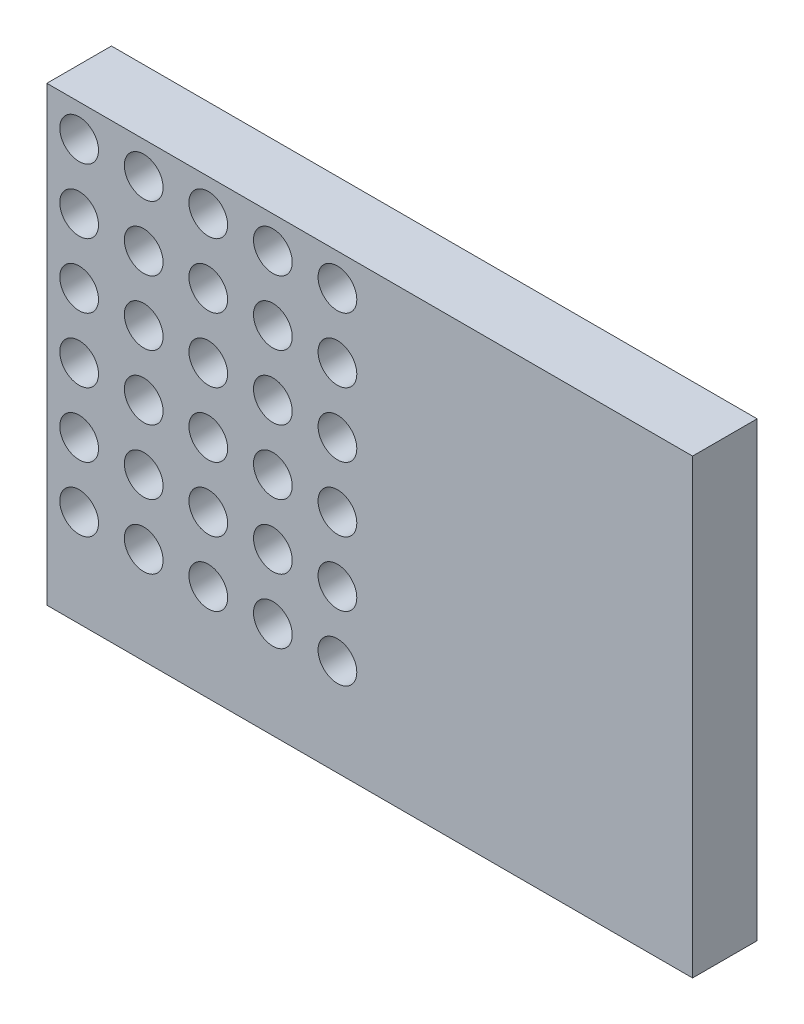
ISO-10303-21;
HEADER;
FILE_DESCRIPTION(('STEP AP214'),'2;1');
FILE_NAME('part.step','',(''),(''),'','','');
FILE_SCHEMA(('AUTOMOTIVE_DESIGN { 1 0 10303 214 1 1 1 1 }'));
ENDSEC;
DATA;
#1=APPLICATION_CONTEXT('core data for automotive mechanical design processes');
#2=APPLICATION_PROTOCOL_DEFINITION('international standard','automotive_design',2000,#1);
#3=PRODUCT_CONTEXT('',#1,'mechanical');
#4=PRODUCT('Part','Part','',(#3));
#5=PRODUCT_RELATED_PRODUCT_CATEGORY('part','',(#4));
#6=PRODUCT_DEFINITION_FORMATION('','',#4);
#7=PRODUCT_DEFINITION_CONTEXT('part definition',#1,'design');
#8=PRODUCT_DEFINITION('design','',#6,#7);
#9=PRODUCT_DEFINITION_SHAPE('','',#8);
#10=(LENGTH_UNIT() NAMED_UNIT(*) SI_UNIT(.MILLI.,.METRE.));
#11=(NAMED_UNIT(*) PLANE_ANGLE_UNIT() SI_UNIT($,.RADIAN.));
#12=(NAMED_UNIT(*) SI_UNIT($,.STERADIAN.) SOLID_ANGLE_UNIT());
#13=UNCERTAINTY_MEASURE_WITH_UNIT(LENGTH_MEASURE(1.E-05),#10,'distance_accuracy_value','');
#14=(GEOMETRIC_REPRESENTATION_CONTEXT(3) GLOBAL_UNCERTAINTY_ASSIGNED_CONTEXT((#13)) GLOBAL_UNIT_ASSIGNED_CONTEXT((#10,
#11,#12)) REPRESENTATION_CONTEXT('',''));
#15=CARTESIAN_POINT('',(0.,0.,0.));
#16=DIRECTION('',(0.,0.,1.));
#17=DIRECTION('',(1.,0.,0.));
#18=AXIS2_PLACEMENT_3D('',#15,#16,#17);
#19=CARTESIAN_POINT('',(-5.00000000000001,-20.,-5.));
#20=DIRECTION('',(0.,0.,1.));
#21=DIRECTION('',(1.,0.,0.));
#22=AXIS2_PLACEMENT_3D('',#19,#20,#21);
#23=CYLINDRICAL_SURFACE('',#22,3.);
#24=CARTESIAN_POINT('',(-5.00000000000001,-20.,-5.));
#25=DIRECTION('',(0.,0.,1.));
#26=DIRECTION('',(1.,0.,0.));
#27=AXIS2_PLACEMENT_3D('',#24,#25,#26);
#28=CIRCLE('',#27,3.);
#29=CARTESIAN_POINT('',(-2.00000000000001,-20.,-5.));
#30=VERTEX_POINT('',#29);
#31=EDGE_CURVE('E45',#30,#30,#28,.T.);
#32=ORIENTED_EDGE('',*,*,#31,.F.);
#33=EDGE_LOOP('',(#32));
#34=FACE_BOUND('',#33,.T.);
#35=CARTESIAN_POINT('',(-5.00000000000001,-20.,5.));
#36=DIRECTION('',(0.,0.,1.));
#37=DIRECTION('',(1.,0.,0.));
#38=AXIS2_PLACEMENT_3D('',#35,#36,#37);
#39=CIRCLE('',#38,3.);
#40=CARTESIAN_POINT('',(-2.00000000000001,-20.,5.));
#41=VERTEX_POINT('',#40);
#42=EDGE_CURVE('E11',#41,#41,#39,.T.);
#43=ORIENTED_EDGE('',*,*,#42,.T.);
#44=EDGE_LOOP('',(#43));
#45=FACE_BOUND('',#44,.T.);
#46=ADVANCED_FACE('F37',(#34,#45),#23,.F.);
#47=CARTESIAN_POINT('',(-15.,-20.,-5.));
#48=DIRECTION('',(0.,0.,1.));
#49=DIRECTION('',(1.,0.,0.));
#50=AXIS2_PLACEMENT_3D('',#47,#48,#49);
#51=CYLINDRICAL_SURFACE('',#50,3.);
#52=CARTESIAN_POINT('',(-15.,-20.,-5.));
#53=DIRECTION('',(0.,0.,1.));
#54=DIRECTION('',(1.,0.,0.));
#55=AXIS2_PLACEMENT_3D('',#52,#53,#54);
#56=CIRCLE('',#55,3.);
#57=CARTESIAN_POINT('',(-12.,-20.,-5.));
#58=VERTEX_POINT('',#57);
#59=EDGE_CURVE('E271',#58,#58,#56,.T.);
#60=ORIENTED_EDGE('',*,*,#59,.F.);
#61=EDGE_LOOP('',(#60));
#62=FACE_BOUND('',#61,.T.);
#63=CARTESIAN_POINT('',(-15.,-20.,5.));
#64=DIRECTION('',(0.,0.,1.));
#65=DIRECTION('',(1.,0.,0.));
#66=AXIS2_PLACEMENT_3D('',#63,#64,#65);
#67=CIRCLE('',#66,3.);
#68=CARTESIAN_POINT('',(-12.,-20.,5.));
#69=VERTEX_POINT('',#68);
#70=EDGE_CURVE('E274',#69,#69,#67,.T.);
#71=ORIENTED_EDGE('',*,*,#70,.T.);
#72=EDGE_LOOP('',(#71));
#73=FACE_BOUND('',#72,.T.);
#74=ADVANCED_FACE('F283',(#62,#73),#51,.F.);
#75=CARTESIAN_POINT('',(-25.,-20.,-5.));
#76=DIRECTION('',(0.,0.,1.));
#77=DIRECTION('',(1.,0.,0.));
#78=AXIS2_PLACEMENT_3D('',#75,#76,#77);
#79=CYLINDRICAL_SURFACE('',#78,3.);
#80=CARTESIAN_POINT('',(-25.,-20.,-5.));
#81=DIRECTION('',(0.,0.,1.));
#82=DIRECTION('',(1.,0.,0.));
#83=AXIS2_PLACEMENT_3D('',#80,#81,#82);
#84=CIRCLE('',#83,3.);
#85=CARTESIAN_POINT('',(-22.,-20.,-5.));
#86=VERTEX_POINT('',#85);
#87=EDGE_CURVE('E265',#86,#86,#84,.T.);
#88=ORIENTED_EDGE('',*,*,#87,.F.);
#89=EDGE_LOOP('',(#88));
#90=FACE_BOUND('',#89,.T.);
#91=CARTESIAN_POINT('',(-25.,-20.,5.));
#92=DIRECTION('',(0.,0.,1.));
#93=DIRECTION('',(1.,0.,0.));
#94=AXIS2_PLACEMENT_3D('',#91,#92,#93);
#95=CIRCLE('',#94,3.);
#96=CARTESIAN_POINT('',(-22.,-20.,5.));
#97=VERTEX_POINT('',#96);
#98=EDGE_CURVE('E268',#97,#97,#95,.T.);
#99=ORIENTED_EDGE('',*,*,#98,.T.);
#100=EDGE_LOOP('',(#99));
#101=FACE_BOUND('',#100,.T.);
#102=ADVANCED_FACE('F410',(#90,#101),#79,.F.);
#103=CARTESIAN_POINT('',(-35.,-20.,-5.));
#104=DIRECTION('',(0.,0.,1.));
#105=DIRECTION('',(1.,0.,0.));
#106=AXIS2_PLACEMENT_3D('',#103,#104,#105);
#107=CYLINDRICAL_SURFACE('',#106,3.);
#108=CARTESIAN_POINT('',(-35.,-20.,-5.));
#109=DIRECTION('',(0.,0.,1.));
#110=DIRECTION('',(1.,0.,0.));
#111=AXIS2_PLACEMENT_3D('',#108,#109,#110);
#112=CIRCLE('',#111,3.);
#113=CARTESIAN_POINT('',(-32.,-20.,-5.));
#114=VERTEX_POINT('',#113);
#115=EDGE_CURVE('E259',#114,#114,#112,.T.);
#116=ORIENTED_EDGE('',*,*,#115,.F.);
#117=EDGE_LOOP('',(#116));
#118=FACE_BOUND('',#117,.T.);
#119=CARTESIAN_POINT('',(-35.,-20.,5.));
#120=DIRECTION('',(0.,0.,1.));
#121=DIRECTION('',(1.,0.,0.));
#122=AXIS2_PLACEMENT_3D('',#119,#120,#121);
#123=CIRCLE('',#122,3.);
#124=CARTESIAN_POINT('',(-32.,-20.,5.));
#125=VERTEX_POINT('',#124);
#126=EDGE_CURVE('E262',#125,#125,#123,.T.);
#127=ORIENTED_EDGE('',*,*,#126,.T.);
#128=EDGE_LOOP('',(#127));
#129=FACE_BOUND('',#128,.T.);
#130=ADVANCED_FACE('F406',(#118,#129),#107,.F.);
#131=CARTESIAN_POINT('',(-45.,-20.,-5.));
#132=DIRECTION('',(0.,0.,1.));
#133=DIRECTION('',(1.,0.,0.));
#134=AXIS2_PLACEMENT_3D('',#131,#132,#133);
#135=CYLINDRICAL_SURFACE('',#134,3.);
#136=CARTESIAN_POINT('',(-45.,-20.,-5.));
#137=DIRECTION('',(0.,0.,1.));
#138=DIRECTION('',(1.,0.,0.));
#139=AXIS2_PLACEMENT_3D('',#136,#137,#138);
#140=CIRCLE('',#139,3.);
#141=CARTESIAN_POINT('',(-42.,-20.,-5.));
#142=VERTEX_POINT('',#141);
#143=EDGE_CURVE('E253',#142,#142,#140,.T.);
#144=ORIENTED_EDGE('',*,*,#143,.F.);
#145=EDGE_LOOP('',(#144));
#146=FACE_BOUND('',#145,.T.);
#147=CARTESIAN_POINT('',(-45.,-20.,5.));
#148=DIRECTION('',(0.,0.,1.));
#149=DIRECTION('',(1.,0.,0.));
#150=AXIS2_PLACEMENT_3D('',#147,#148,#149);
#151=CIRCLE('',#150,3.);
#152=CARTESIAN_POINT('',(-42.,-20.,5.));
#153=VERTEX_POINT('',#152);
#154=EDGE_CURVE('E256',#153,#153,#151,.T.);
#155=ORIENTED_EDGE('',*,*,#154,.T.);
#156=EDGE_LOOP('',(#155));
#157=FACE_BOUND('',#156,.T.);
#158=ADVANCED_FACE('F402',(#146,#157),#135,.F.);
#159=CARTESIAN_POINT('',(-5.00000000000001,-10.,-5.));
#160=DIRECTION('',(0.,0.,1.));
#161=DIRECTION('',(1.,0.,0.));
#162=AXIS2_PLACEMENT_3D('',#159,#160,#161);
#163=CYLINDRICAL_SURFACE('',#162,3.);
#164=CARTESIAN_POINT('',(-5.00000000000001,-10.,-5.));
#165=DIRECTION('',(0.,0.,1.));
#166=DIRECTION('',(1.,0.,0.));
#167=AXIS2_PLACEMENT_3D('',#164,#165,#166);
#168=CIRCLE('',#167,3.);
#169=CARTESIAN_POINT('',(-2.00000000000001,-10.,-5.));
#170=VERTEX_POINT('',#169);
#171=EDGE_CURVE('E247',#170,#170,#168,.T.);
#172=ORIENTED_EDGE('',*,*,#171,.F.);
#173=EDGE_LOOP('',(#172));
#174=FACE_BOUND('',#173,.T.);
#175=CARTESIAN_POINT('',(-5.00000000000001,-10.,5.));
#176=DIRECTION('',(0.,0.,1.));
#177=DIRECTION('',(1.,0.,0.));
#178=AXIS2_PLACEMENT_3D('',#175,#176,#177);
#179=CIRCLE('',#178,3.);
#180=CARTESIAN_POINT('',(-2.00000000000001,-10.,5.));
#181=VERTEX_POINT('',#180);
#182=EDGE_CURVE('E250',#181,#181,#179,.T.);
#183=ORIENTED_EDGE('',*,*,#182,.T.);
#184=EDGE_LOOP('',(#183));
#185=FACE_BOUND('',#184,.T.);
#186=ADVANCED_FACE('F398',(#174,#185),#163,.F.);
#187=CARTESIAN_POINT('',(-15.,-10.,-5.));
#188=DIRECTION('',(0.,0.,1.));
#189=DIRECTION('',(1.,0.,0.));
#190=AXIS2_PLACEMENT_3D('',#187,#188,#189);
#191=CYLINDRICAL_SURFACE('',#190,3.);
#192=CARTESIAN_POINT('',(-15.,-10.,-5.));
#193=DIRECTION('',(0.,0.,1.));
#194=DIRECTION('',(1.,0.,0.));
#195=AXIS2_PLACEMENT_3D('',#192,#193,#194);
#196=CIRCLE('',#195,3.);
#197=CARTESIAN_POINT('',(-12.,-10.,-5.));
#198=VERTEX_POINT('',#197);
#199=EDGE_CURVE('E241',#198,#198,#196,.T.);
#200=ORIENTED_EDGE('',*,*,#199,.F.);
#201=EDGE_LOOP('',(#200));
#202=FACE_BOUND('',#201,.T.);
#203=CARTESIAN_POINT('',(-15.,-10.,5.));
#204=DIRECTION('',(0.,0.,1.));
#205=DIRECTION('',(1.,0.,0.));
#206=AXIS2_PLACEMENT_3D('',#203,#204,#205);
#207=CIRCLE('',#206,3.);
#208=CARTESIAN_POINT('',(-12.,-10.,5.));
#209=VERTEX_POINT('',#208);
#210=EDGE_CURVE('E244',#209,#209,#207,.T.);
#211=ORIENTED_EDGE('',*,*,#210,.T.);
#212=EDGE_LOOP('',(#211));
#213=FACE_BOUND('',#212,.T.);
#214=ADVANCED_FACE('F394',(#202,#213),#191,.F.);
#215=CARTESIAN_POINT('',(-25.,-10.,-5.));
#216=DIRECTION('',(0.,0.,1.));
#217=DIRECTION('',(1.,0.,0.));
#218=AXIS2_PLACEMENT_3D('',#215,#216,#217);
#219=CYLINDRICAL_SURFACE('',#218,3.);
#220=CARTESIAN_POINT('',(-25.,-10.,-5.));
#221=DIRECTION('',(0.,0.,1.));
#222=DIRECTION('',(1.,0.,0.));
#223=AXIS2_PLACEMENT_3D('',#220,#221,#222);
#224=CIRCLE('',#223,3.);
#225=CARTESIAN_POINT('',(-22.,-10.,-5.));
#226=VERTEX_POINT('',#225);
#227=EDGE_CURVE('E235',#226,#226,#224,.T.);
#228=ORIENTED_EDGE('',*,*,#227,.F.);
#229=EDGE_LOOP('',(#228));
#230=FACE_BOUND('',#229,.T.);
#231=CARTESIAN_POINT('',(-25.,-10.,5.));
#232=DIRECTION('',(0.,0.,1.));
#233=DIRECTION('',(1.,0.,0.));
#234=AXIS2_PLACEMENT_3D('',#231,#232,#233);
#235=CIRCLE('',#234,3.);
#236=CARTESIAN_POINT('',(-22.,-10.,5.));
#237=VERTEX_POINT('',#236);
#238=EDGE_CURVE('E238',#237,#237,#235,.T.);
#239=ORIENTED_EDGE('',*,*,#238,.T.);
#240=EDGE_LOOP('',(#239));
#241=FACE_BOUND('',#240,.T.);
#242=ADVANCED_FACE('F390',(#230,#241),#219,.F.);
#243=CARTESIAN_POINT('',(-35.,-10.,-5.));
#244=DIRECTION('',(0.,0.,1.));
#245=DIRECTION('',(1.,0.,0.));
#246=AXIS2_PLACEMENT_3D('',#243,#244,#245);
#247=CYLINDRICAL_SURFACE('',#246,3.);
#248=CARTESIAN_POINT('',(-35.,-10.,-5.));
#249=DIRECTION('',(0.,0.,1.));
#250=DIRECTION('',(1.,0.,0.));
#251=AXIS2_PLACEMENT_3D('',#248,#249,#250);
#252=CIRCLE('',#251,3.);
#253=CARTESIAN_POINT('',(-32.,-10.,-5.));
#254=VERTEX_POINT('',#253);
#255=EDGE_CURVE('E229',#254,#254,#252,.T.);
#256=ORIENTED_EDGE('',*,*,#255,.F.);
#257=EDGE_LOOP('',(#256));
#258=FACE_BOUND('',#257,.T.);
#259=CARTESIAN_POINT('',(-35.,-10.,5.));
#260=DIRECTION('',(0.,0.,1.));
#261=DIRECTION('',(1.,0.,0.));
#262=AXIS2_PLACEMENT_3D('',#259,#260,#261);
#263=CIRCLE('',#262,3.);
#264=CARTESIAN_POINT('',(-32.,-10.,5.));
#265=VERTEX_POINT('',#264);
#266=EDGE_CURVE('E232',#265,#265,#263,.T.);
#267=ORIENTED_EDGE('',*,*,#266,.T.);
#268=EDGE_LOOP('',(#267));
#269=FACE_BOUND('',#268,.T.);
#270=ADVANCED_FACE('F386',(#258,#269),#247,.F.);
#271=CARTESIAN_POINT('',(-45.,-10.,-5.));
#272=DIRECTION('',(0.,0.,1.));
#273=DIRECTION('',(1.,0.,0.));
#274=AXIS2_PLACEMENT_3D('',#271,#272,#273);
#275=CYLINDRICAL_SURFACE('',#274,3.);
#276=CARTESIAN_POINT('',(-45.,-10.,-5.));
#277=DIRECTION('',(0.,0.,1.));
#278=DIRECTION('',(1.,0.,0.));
#279=AXIS2_PLACEMENT_3D('',#276,#277,#278);
#280=CIRCLE('',#279,3.);
#281=CARTESIAN_POINT('',(-42.,-10.,-5.));
#282=VERTEX_POINT('',#281);
#283=EDGE_CURVE('E223',#282,#282,#280,.T.);
#284=ORIENTED_EDGE('',*,*,#283,.F.);
#285=EDGE_LOOP('',(#284));
#286=FACE_BOUND('',#285,.T.);
#287=CARTESIAN_POINT('',(-45.,-10.,5.));
#288=DIRECTION('',(0.,0.,1.));
#289=DIRECTION('',(1.,0.,0.));
#290=AXIS2_PLACEMENT_3D('',#287,#288,#289);
#291=CIRCLE('',#290,3.);
#292=CARTESIAN_POINT('',(-42.,-10.,5.));
#293=VERTEX_POINT('',#292);
#294=EDGE_CURVE('E226',#293,#293,#291,.T.);
#295=ORIENTED_EDGE('',*,*,#294,.T.);
#296=EDGE_LOOP('',(#295));
#297=FACE_BOUND('',#296,.T.);
#298=ADVANCED_FACE('F382',(#286,#297),#275,.F.);
#299=CARTESIAN_POINT('',(-5.00000000000001,0.,-5.));
#300=DIRECTION('',(0.,0.,1.));
#301=DIRECTION('',(1.,0.,0.));
#302=AXIS2_PLACEMENT_3D('',#299,#300,#301);
#303=CYLINDRICAL_SURFACE('',#302,3.);
#304=CARTESIAN_POINT('',(-5.00000000000001,0.,-5.));
#305=DIRECTION('',(0.,0.,1.));
#306=DIRECTION('',(1.,0.,0.));
#307=AXIS2_PLACEMENT_3D('',#304,#305,#306);
#308=CIRCLE('',#307,3.);
#309=CARTESIAN_POINT('',(-2.00000000000001,0.,-5.));
#310=VERTEX_POINT('',#309);
#311=EDGE_CURVE('E217',#310,#310,#308,.T.);
#312=ORIENTED_EDGE('',*,*,#311,.F.);
#313=EDGE_LOOP('',(#312));
#314=FACE_BOUND('',#313,.T.);
#315=CARTESIAN_POINT('',(-5.00000000000001,0.,5.));
#316=DIRECTION('',(0.,0.,1.));
#317=DIRECTION('',(1.,0.,0.));
#318=AXIS2_PLACEMENT_3D('',#315,#316,#317);
#319=CIRCLE('',#318,3.);
#320=CARTESIAN_POINT('',(-2.00000000000001,0.,5.));
#321=VERTEX_POINT('',#320);
#322=EDGE_CURVE('E220',#321,#321,#319,.T.);
#323=ORIENTED_EDGE('',*,*,#322,.T.);
#324=EDGE_LOOP('',(#323));
#325=FACE_BOUND('',#324,.T.);
#326=ADVANCED_FACE('F378',(#314,#325),#303,.F.);
#327=CARTESIAN_POINT('',(-15.,0.,-5.));
#328=DIRECTION('',(0.,0.,1.));
#329=DIRECTION('',(1.,0.,0.));
#330=AXIS2_PLACEMENT_3D('',#327,#328,#329);
#331=CYLINDRICAL_SURFACE('',#330,3.);
#332=CARTESIAN_POINT('',(-15.,0.,-5.));
#333=DIRECTION('',(0.,0.,1.));
#334=DIRECTION('',(1.,0.,0.));
#335=AXIS2_PLACEMENT_3D('',#332,#333,#334);
#336=CIRCLE('',#335,3.);
#337=CARTESIAN_POINT('',(-12.,0.,-5.));
#338=VERTEX_POINT('',#337);
#339=EDGE_CURVE('E211',#338,#338,#336,.T.);
#340=ORIENTED_EDGE('',*,*,#339,.F.);
#341=EDGE_LOOP('',(#340));
#342=FACE_BOUND('',#341,.T.);
#343=CARTESIAN_POINT('',(-15.,0.,5.));
#344=DIRECTION('',(0.,0.,1.));
#345=DIRECTION('',(1.,0.,0.));
#346=AXIS2_PLACEMENT_3D('',#343,#344,#345);
#347=CIRCLE('',#346,3.);
#348=CARTESIAN_POINT('',(-12.,0.,5.));
#349=VERTEX_POINT('',#348);
#350=EDGE_CURVE('E214',#349,#349,#347,.T.);
#351=ORIENTED_EDGE('',*,*,#350,.T.);
#352=EDGE_LOOP('',(#351));
#353=FACE_BOUND('',#352,.T.);
#354=ADVANCED_FACE('F374',(#342,#353),#331,.F.);
#355=CARTESIAN_POINT('',(-25.,0.,-5.));
#356=DIRECTION('',(0.,0.,1.));
#357=DIRECTION('',(1.,0.,0.));
#358=AXIS2_PLACEMENT_3D('',#355,#356,#357);
#359=CYLINDRICAL_SURFACE('',#358,3.);
#360=CARTESIAN_POINT('',(-25.,0.,-5.));
#361=DIRECTION('',(0.,0.,1.));
#362=DIRECTION('',(1.,0.,0.));
#363=AXIS2_PLACEMENT_3D('',#360,#361,#362);
#364=CIRCLE('',#363,3.);
#365=CARTESIAN_POINT('',(-22.,0.,-5.));
#366=VERTEX_POINT('',#365);
#367=EDGE_CURVE('E205',#366,#366,#364,.T.);
#368=ORIENTED_EDGE('',*,*,#367,.F.);
#369=EDGE_LOOP('',(#368));
#370=FACE_BOUND('',#369,.T.);
#371=CARTESIAN_POINT('',(-25.,0.,5.));
#372=DIRECTION('',(0.,0.,1.));
#373=DIRECTION('',(1.,0.,0.));
#374=AXIS2_PLACEMENT_3D('',#371,#372,#373);
#375=CIRCLE('',#374,3.);
#376=CARTESIAN_POINT('',(-22.,0.,5.));
#377=VERTEX_POINT('',#376);
#378=EDGE_CURVE('E208',#377,#377,#375,.T.);
#379=ORIENTED_EDGE('',*,*,#378,.T.);
#380=EDGE_LOOP('',(#379));
#381=FACE_BOUND('',#380,.T.);
#382=ADVANCED_FACE('F370',(#370,#381),#359,.F.);
#383=CARTESIAN_POINT('',(-35.,0.,-5.));
#384=DIRECTION('',(0.,0.,1.));
#385=DIRECTION('',(1.,0.,0.));
#386=AXIS2_PLACEMENT_3D('',#383,#384,#385);
#387=CYLINDRICAL_SURFACE('',#386,3.);
#388=CARTESIAN_POINT('',(-35.,0.,-5.));
#389=DIRECTION('',(0.,0.,1.));
#390=DIRECTION('',(1.,0.,0.));
#391=AXIS2_PLACEMENT_3D('',#388,#389,#390);
#392=CIRCLE('',#391,3.);
#393=CARTESIAN_POINT('',(-32.,0.,-5.));
#394=VERTEX_POINT('',#393);
#395=EDGE_CURVE('E199',#394,#394,#392,.T.);
#396=ORIENTED_EDGE('',*,*,#395,.F.);
#397=EDGE_LOOP('',(#396));
#398=FACE_BOUND('',#397,.T.);
#399=CARTESIAN_POINT('',(-35.,0.,5.));
#400=DIRECTION('',(0.,0.,1.));
#401=DIRECTION('',(1.,0.,0.));
#402=AXIS2_PLACEMENT_3D('',#399,#400,#401);
#403=CIRCLE('',#402,3.);
#404=CARTESIAN_POINT('',(-32.,0.,5.));
#405=VERTEX_POINT('',#404);
#406=EDGE_CURVE('E202',#405,#405,#403,.T.);
#407=ORIENTED_EDGE('',*,*,#406,.T.);
#408=EDGE_LOOP('',(#407));
#409=FACE_BOUND('',#408,.T.);
#410=ADVANCED_FACE('F366',(#398,#409),#387,.F.);
#411=CARTESIAN_POINT('',(-45.,0.,-5.));
#412=DIRECTION('',(0.,0.,1.));
#413=DIRECTION('',(1.,0.,0.));
#414=AXIS2_PLACEMENT_3D('',#411,#412,#413);
#415=CYLINDRICAL_SURFACE('',#414,3.);
#416=CARTESIAN_POINT('',(-45.,0.,-5.));
#417=DIRECTION('',(0.,0.,1.));
#418=DIRECTION('',(1.,0.,0.));
#419=AXIS2_PLACEMENT_3D('',#416,#417,#418);
#420=CIRCLE('',#419,3.);
#421=CARTESIAN_POINT('',(-42.,0.,-5.));
#422=VERTEX_POINT('',#421);
#423=EDGE_CURVE('E193',#422,#422,#420,.T.);
#424=ORIENTED_EDGE('',*,*,#423,.F.);
#425=EDGE_LOOP('',(#424));
#426=FACE_BOUND('',#425,.T.);
#427=CARTESIAN_POINT('',(-45.,0.,5.));
#428=DIRECTION('',(0.,0.,1.));
#429=DIRECTION('',(1.,0.,0.));
#430=AXIS2_PLACEMENT_3D('',#427,#428,#429);
#431=CIRCLE('',#430,3.);
#432=CARTESIAN_POINT('',(-42.,0.,5.));
#433=VERTEX_POINT('',#432);
#434=EDGE_CURVE('E196',#433,#433,#431,.T.);
#435=ORIENTED_EDGE('',*,*,#434,.T.);
#436=EDGE_LOOP('',(#435));
#437=FACE_BOUND('',#436,.T.);
#438=ADVANCED_FACE('F362',(#426,#437),#415,.F.);
#439=CARTESIAN_POINT('',(-5.00000000000001,10.,-5.));
#440=DIRECTION('',(0.,0.,1.));
#441=DIRECTION('',(1.,0.,0.));
#442=AXIS2_PLACEMENT_3D('',#439,#440,#441);
#443=CYLINDRICAL_SURFACE('',#442,3.);
#444=CARTESIAN_POINT('',(-5.00000000000001,10.,-5.));
#445=DIRECTION('',(0.,0.,1.));
#446=DIRECTION('',(1.,0.,0.));
#447=AXIS2_PLACEMENT_3D('',#444,#445,#446);
#448=CIRCLE('',#447,3.);
#449=CARTESIAN_POINT('',(-2.00000000000001,10.,-5.));
#450=VERTEX_POINT('',#449);
#451=EDGE_CURVE('E187',#450,#450,#448,.T.);
#452=ORIENTED_EDGE('',*,*,#451,.F.);
#453=EDGE_LOOP('',(#452));
#454=FACE_BOUND('',#453,.T.);
#455=CARTESIAN_POINT('',(-5.00000000000001,10.,5.));
#456=DIRECTION('',(0.,0.,1.));
#457=DIRECTION('',(1.,0.,0.));
#458=AXIS2_PLACEMENT_3D('',#455,#456,#457);
#459=CIRCLE('',#458,3.);
#460=CARTESIAN_POINT('',(-2.00000000000001,10.,5.));
#461=VERTEX_POINT('',#460);
#462=EDGE_CURVE('E190',#461,#461,#459,.T.);
#463=ORIENTED_EDGE('',*,*,#462,.T.);
#464=EDGE_LOOP('',(#463));
#465=FACE_BOUND('',#464,.T.);
#466=ADVANCED_FACE('F358',(#454,#465),#443,.F.);
#467=CARTESIAN_POINT('',(-15.,10.,-5.));
#468=DIRECTION('',(0.,0.,1.));
#469=DIRECTION('',(1.,0.,0.));
#470=AXIS2_PLACEMENT_3D('',#467,#468,#469);
#471=CYLINDRICAL_SURFACE('',#470,3.);
#472=CARTESIAN_POINT('',(-15.,10.,-5.));
#473=DIRECTION('',(0.,0.,1.));
#474=DIRECTION('',(1.,0.,0.));
#475=AXIS2_PLACEMENT_3D('',#472,#473,#474);
#476=CIRCLE('',#475,3.);
#477=CARTESIAN_POINT('',(-12.,10.,-5.));
#478=VERTEX_POINT('',#477);
#479=EDGE_CURVE('E181',#478,#478,#476,.T.);
#480=ORIENTED_EDGE('',*,*,#479,.F.);
#481=EDGE_LOOP('',(#480));
#482=FACE_BOUND('',#481,.T.);
#483=CARTESIAN_POINT('',(-15.,10.,5.));
#484=DIRECTION('',(0.,0.,1.));
#485=DIRECTION('',(1.,0.,0.));
#486=AXIS2_PLACEMENT_3D('',#483,#484,#485);
#487=CIRCLE('',#486,3.);
#488=CARTESIAN_POINT('',(-12.,10.,5.));
#489=VERTEX_POINT('',#488);
#490=EDGE_CURVE('E184',#489,#489,#487,.T.);
#491=ORIENTED_EDGE('',*,*,#490,.T.);
#492=EDGE_LOOP('',(#491));
#493=FACE_BOUND('',#492,.T.);
#494=ADVANCED_FACE('F354',(#482,#493),#471,.F.);
#495=CARTESIAN_POINT('',(-25.,10.,-5.));
#496=DIRECTION('',(0.,0.,1.));
#497=DIRECTION('',(1.,0.,0.));
#498=AXIS2_PLACEMENT_3D('',#495,#496,#497);
#499=CYLINDRICAL_SURFACE('',#498,3.);
#500=CARTESIAN_POINT('',(-25.,10.,-5.));
#501=DIRECTION('',(0.,0.,1.));
#502=DIRECTION('',(1.,0.,0.));
#503=AXIS2_PLACEMENT_3D('',#500,#501,#502);
#504=CIRCLE('',#503,3.);
#505=CARTESIAN_POINT('',(-22.,10.,-5.));
#506=VERTEX_POINT('',#505);
#507=EDGE_CURVE('E175',#506,#506,#504,.T.);
#508=ORIENTED_EDGE('',*,*,#507,.F.);
#509=EDGE_LOOP('',(#508));
#510=FACE_BOUND('',#509,.T.);
#511=CARTESIAN_POINT('',(-25.,10.,5.));
#512=DIRECTION('',(0.,0.,1.));
#513=DIRECTION('',(1.,0.,0.));
#514=AXIS2_PLACEMENT_3D('',#511,#512,#513);
#515=CIRCLE('',#514,3.);
#516=CARTESIAN_POINT('',(-22.,10.,5.));
#517=VERTEX_POINT('',#516);
#518=EDGE_CURVE('E178',#517,#517,#515,.T.);
#519=ORIENTED_EDGE('',*,*,#518,.T.);
#520=EDGE_LOOP('',(#519));
#521=FACE_BOUND('',#520,.T.);
#522=ADVANCED_FACE('F350',(#510,#521),#499,.F.);
#523=CARTESIAN_POINT('',(-35.,10.,-5.));
#524=DIRECTION('',(0.,0.,1.));
#525=DIRECTION('',(1.,0.,0.));
#526=AXIS2_PLACEMENT_3D('',#523,#524,#525);
#527=CYLINDRICAL_SURFACE('',#526,3.);
#528=CARTESIAN_POINT('',(-35.,10.,-5.));
#529=DIRECTION('',(0.,0.,1.));
#530=DIRECTION('',(1.,0.,0.));
#531=AXIS2_PLACEMENT_3D('',#528,#529,#530);
#532=CIRCLE('',#531,3.);
#533=CARTESIAN_POINT('',(-32.,10.,-5.));
#534=VERTEX_POINT('',#533);
#535=EDGE_CURVE('E169',#534,#534,#532,.T.);
#536=ORIENTED_EDGE('',*,*,#535,.F.);
#537=EDGE_LOOP('',(#536));
#538=FACE_BOUND('',#537,.T.);
#539=CARTESIAN_POINT('',(-35.,10.,5.));
#540=DIRECTION('',(0.,0.,1.));
#541=DIRECTION('',(1.,0.,0.));
#542=AXIS2_PLACEMENT_3D('',#539,#540,#541);
#543=CIRCLE('',#542,3.);
#544=CARTESIAN_POINT('',(-32.,10.,5.));
#545=VERTEX_POINT('',#544);
#546=EDGE_CURVE('E172',#545,#545,#543,.T.);
#547=ORIENTED_EDGE('',*,*,#546,.T.);
#548=EDGE_LOOP('',(#547));
#549=FACE_BOUND('',#548,.T.);
#550=ADVANCED_FACE('F346',(#538,#549),#527,.F.);
#551=CARTESIAN_POINT('',(-45.,10.,-5.));
#552=DIRECTION('',(0.,0.,1.));
#553=DIRECTION('',(1.,0.,0.));
#554=AXIS2_PLACEMENT_3D('',#551,#552,#553);
#555=CYLINDRICAL_SURFACE('',#554,3.);
#556=CARTESIAN_POINT('',(-45.,10.,-5.));
#557=DIRECTION('',(0.,0.,1.));
#558=DIRECTION('',(1.,0.,0.));
#559=AXIS2_PLACEMENT_3D('',#556,#557,#558);
#560=CIRCLE('',#559,3.);
#561=CARTESIAN_POINT('',(-42.,10.,-5.));
#562=VERTEX_POINT('',#561);
#563=EDGE_CURVE('E163',#562,#562,#560,.T.);
#564=ORIENTED_EDGE('',*,*,#563,.F.);
#565=EDGE_LOOP('',(#564));
#566=FACE_BOUND('',#565,.T.);
#567=CARTESIAN_POINT('',(-45.,10.,5.));
#568=DIRECTION('',(0.,0.,1.));
#569=DIRECTION('',(1.,0.,0.));
#570=AXIS2_PLACEMENT_3D('',#567,#568,#569);
#571=CIRCLE('',#570,3.);
#572=CARTESIAN_POINT('',(-42.,10.,5.));
#573=VERTEX_POINT('',#572);
#574=EDGE_CURVE('E166',#573,#573,#571,.T.);
#575=ORIENTED_EDGE('',*,*,#574,.T.);
#576=EDGE_LOOP('',(#575));
#577=FACE_BOUND('',#576,.T.);
#578=ADVANCED_FACE('F342',(#566,#577),#555,.F.);
#579=CARTESIAN_POINT('',(-5.00000000000002,20.,-5.));
#580=DIRECTION('',(0.,0.,1.));
#581=DIRECTION('',(1.,0.,0.));
#582=AXIS2_PLACEMENT_3D('',#579,#580,#581);
#583=CYLINDRICAL_SURFACE('',#582,3.);
#584=CARTESIAN_POINT('',(-5.00000000000002,20.,-5.));
#585=DIRECTION('',(0.,0.,1.));
#586=DIRECTION('',(1.,0.,0.));
#587=AXIS2_PLACEMENT_3D('',#584,#585,#586);
#588=CIRCLE('',#587,3.);
#589=CARTESIAN_POINT('',(-2.00000000000002,20.,-5.));
#590=VERTEX_POINT('',#589);
#591=EDGE_CURVE('E157',#590,#590,#588,.T.);
#592=ORIENTED_EDGE('',*,*,#591,.F.);
#593=EDGE_LOOP('',(#592));
#594=FACE_BOUND('',#593,.T.);
#595=CARTESIAN_POINT('',(-5.00000000000002,20.,5.));
#596=DIRECTION('',(0.,0.,1.));
#597=DIRECTION('',(1.,0.,0.));
#598=AXIS2_PLACEMENT_3D('',#595,#596,#597);
#599=CIRCLE('',#598,3.);
#600=CARTESIAN_POINT('',(-2.00000000000002,20.,5.));
#601=VERTEX_POINT('',#600);
#602=EDGE_CURVE('E160',#601,#601,#599,.T.);
#603=ORIENTED_EDGE('',*,*,#602,.T.);
#604=EDGE_LOOP('',(#603));
#605=FACE_BOUND('',#604,.T.);
#606=ADVANCED_FACE('F338',(#594,#605),#583,.F.);
#607=CARTESIAN_POINT('',(-15.,20.,-5.));
#608=DIRECTION('',(0.,0.,1.));
#609=DIRECTION('',(1.,0.,0.));
#610=AXIS2_PLACEMENT_3D('',#607,#608,#609);
#611=CYLINDRICAL_SURFACE('',#610,3.);
#612=CARTESIAN_POINT('',(-15.,20.,-5.));
#613=DIRECTION('',(0.,0.,1.));
#614=DIRECTION('',(1.,0.,0.));
#615=AXIS2_PLACEMENT_3D('',#612,#613,#614);
#616=CIRCLE('',#615,3.);
#617=CARTESIAN_POINT('',(-12.,20.,-5.));
#618=VERTEX_POINT('',#617);
#619=EDGE_CURVE('E151',#618,#618,#616,.T.);
#620=ORIENTED_EDGE('',*,*,#619,.F.);
#621=EDGE_LOOP('',(#620));
#622=FACE_BOUND('',#621,.T.);
#623=CARTESIAN_POINT('',(-15.,20.,5.));
#624=DIRECTION('',(0.,0.,1.));
#625=DIRECTION('',(1.,0.,0.));
#626=AXIS2_PLACEMENT_3D('',#623,#624,#625);
#627=CIRCLE('',#626,3.);
#628=CARTESIAN_POINT('',(-12.,20.,5.));
#629=VERTEX_POINT('',#628);
#630=EDGE_CURVE('E154',#629,#629,#627,.T.);
#631=ORIENTED_EDGE('',*,*,#630,.T.);
#632=EDGE_LOOP('',(#631));
#633=FACE_BOUND('',#632,.T.);
#634=ADVANCED_FACE('F334',(#622,#633),#611,.F.);
#635=CARTESIAN_POINT('',(-25.,20.,-5.));
#636=DIRECTION('',(0.,0.,1.));
#637=DIRECTION('',(1.,0.,0.));
#638=AXIS2_PLACEMENT_3D('',#635,#636,#637);
#639=CYLINDRICAL_SURFACE('',#638,3.);
#640=CARTESIAN_POINT('',(-25.,20.,-5.));
#641=DIRECTION('',(0.,0.,1.));
#642=DIRECTION('',(1.,0.,0.));
#643=AXIS2_PLACEMENT_3D('',#640,#641,#642);
#644=CIRCLE('',#643,3.);
#645=CARTESIAN_POINT('',(-22.,20.,-5.));
#646=VERTEX_POINT('',#645);
#647=EDGE_CURVE('E145',#646,#646,#644,.T.);
#648=ORIENTED_EDGE('',*,*,#647,.F.);
#649=EDGE_LOOP('',(#648));
#650=FACE_BOUND('',#649,.T.);
#651=CARTESIAN_POINT('',(-25.,20.,5.));
#652=DIRECTION('',(0.,0.,1.));
#653=DIRECTION('',(1.,0.,0.));
#654=AXIS2_PLACEMENT_3D('',#651,#652,#653);
#655=CIRCLE('',#654,3.);
#656=CARTESIAN_POINT('',(-22.,20.,5.));
#657=VERTEX_POINT('',#656);
#658=EDGE_CURVE('E148',#657,#657,#655,.T.);
#659=ORIENTED_EDGE('',*,*,#658,.T.);
#660=EDGE_LOOP('',(#659));
#661=FACE_BOUND('',#660,.T.);
#662=ADVANCED_FACE('F330',(#650,#661),#639,.F.);
#663=CARTESIAN_POINT('',(-35.,20.,-5.));
#664=DIRECTION('',(0.,0.,1.));
#665=DIRECTION('',(1.,0.,0.));
#666=AXIS2_PLACEMENT_3D('',#663,#664,#665);
#667=CYLINDRICAL_SURFACE('',#666,3.);
#668=CARTESIAN_POINT('',(-35.,20.,-5.));
#669=DIRECTION('',(0.,0.,1.));
#670=DIRECTION('',(1.,0.,0.));
#671=AXIS2_PLACEMENT_3D('',#668,#669,#670);
#672=CIRCLE('',#671,3.);
#673=CARTESIAN_POINT('',(-32.,20.,-5.));
#674=VERTEX_POINT('',#673);
#675=EDGE_CURVE('E139',#674,#674,#672,.T.);
#676=ORIENTED_EDGE('',*,*,#675,.F.);
#677=EDGE_LOOP('',(#676));
#678=FACE_BOUND('',#677,.T.);
#679=CARTESIAN_POINT('',(-35.,20.,5.));
#680=DIRECTION('',(0.,0.,1.));
#681=DIRECTION('',(1.,0.,0.));
#682=AXIS2_PLACEMENT_3D('',#679,#680,#681);
#683=CIRCLE('',#682,3.);
#684=CARTESIAN_POINT('',(-32.,20.,5.));
#685=VERTEX_POINT('',#684);
#686=EDGE_CURVE('E142',#685,#685,#683,.T.);
#687=ORIENTED_EDGE('',*,*,#686,.T.);
#688=EDGE_LOOP('',(#687));
#689=FACE_BOUND('',#688,.T.);
#690=ADVANCED_FACE('F326',(#678,#689),#667,.F.);
#691=CARTESIAN_POINT('',(-45.,20.,-5.));
#692=DIRECTION('',(0.,0.,1.));
#693=DIRECTION('',(1.,0.,0.));
#694=AXIS2_PLACEMENT_3D('',#691,#692,#693);
#695=CYLINDRICAL_SURFACE('',#694,3.);
#696=CARTESIAN_POINT('',(-45.,20.,-5.));
#697=DIRECTION('',(0.,0.,1.));
#698=DIRECTION('',(1.,0.,0.));
#699=AXIS2_PLACEMENT_3D('',#696,#697,#698);
#700=CIRCLE('',#699,3.);
#701=CARTESIAN_POINT('',(-42.,20.,-5.));
#702=VERTEX_POINT('',#701);
#703=EDGE_CURVE('E133',#702,#702,#700,.T.);
#704=ORIENTED_EDGE('',*,*,#703,.F.);
#705=EDGE_LOOP('',(#704));
#706=FACE_BOUND('',#705,.T.);
#707=CARTESIAN_POINT('',(-45.,20.,5.));
#708=DIRECTION('',(0.,0.,1.));
#709=DIRECTION('',(1.,0.,0.));
#710=AXIS2_PLACEMENT_3D('',#707,#708,#709);
#711=CIRCLE('',#710,3.);
#712=CARTESIAN_POINT('',(-42.,20.,5.));
#713=VERTEX_POINT('',#712);
#714=EDGE_CURVE('E136',#713,#713,#711,.T.);
#715=ORIENTED_EDGE('',*,*,#714,.T.);
#716=EDGE_LOOP('',(#715));
#717=FACE_BOUND('',#716,.T.);
#718=ADVANCED_FACE('F322',(#706,#717),#695,.F.);
#719=CARTESIAN_POINT('',(-5.00000000000002,30.,-5.));
#720=DIRECTION('',(0.,0.,1.));
#721=DIRECTION('',(1.,0.,0.));
#722=AXIS2_PLACEMENT_3D('',#719,#720,#721);
#723=CYLINDRICAL_SURFACE('',#722,3.);
#724=CARTESIAN_POINT('',(-5.00000000000002,30.,-5.));
#725=DIRECTION('',(0.,0.,1.));
#726=DIRECTION('',(1.,0.,0.));
#727=AXIS2_PLACEMENT_3D('',#724,#725,#726);
#728=CIRCLE('',#727,3.);
#729=CARTESIAN_POINT('',(-2.00000000000002,30.,-5.));
#730=VERTEX_POINT('',#729);
#731=EDGE_CURVE('E127',#730,#730,#728,.T.);
#732=ORIENTED_EDGE('',*,*,#731,.F.);
#733=EDGE_LOOP('',(#732));
#734=FACE_BOUND('',#733,.T.);
#735=CARTESIAN_POINT('',(-5.00000000000002,30.,5.));
#736=DIRECTION('',(0.,0.,1.));
#737=DIRECTION('',(1.,0.,0.));
#738=AXIS2_PLACEMENT_3D('',#735,#736,#737);
#739=CIRCLE('',#738,3.);
#740=CARTESIAN_POINT('',(-2.00000000000002,30.,5.));
#741=VERTEX_POINT('',#740);
#742=EDGE_CURVE('E130',#741,#741,#739,.T.);
#743=ORIENTED_EDGE('',*,*,#742,.T.);
#744=EDGE_LOOP('',(#743));
#745=FACE_BOUND('',#744,.T.);
#746=ADVANCED_FACE('F318',(#734,#745),#723,.F.);
#747=CARTESIAN_POINT('',(-15.,30.,-5.));
#748=DIRECTION('',(0.,0.,1.));
#749=DIRECTION('',(1.,0.,0.));
#750=AXIS2_PLACEMENT_3D('',#747,#748,#749);
#751=CYLINDRICAL_SURFACE('',#750,3.);
#752=CARTESIAN_POINT('',(-15.,30.,-5.));
#753=DIRECTION('',(0.,0.,1.));
#754=DIRECTION('',(1.,0.,0.));
#755=AXIS2_PLACEMENT_3D('',#752,#753,#754);
#756=CIRCLE('',#755,3.);
#757=CARTESIAN_POINT('',(-12.,30.,-5.));
#758=VERTEX_POINT('',#757);
#759=EDGE_CURVE('E121',#758,#758,#756,.T.);
#760=ORIENTED_EDGE('',*,*,#759,.F.);
#761=EDGE_LOOP('',(#760));
#762=FACE_BOUND('',#761,.T.);
#763=CARTESIAN_POINT('',(-15.,30.,5.));
#764=DIRECTION('',(0.,0.,1.));
#765=DIRECTION('',(1.,0.,0.));
#766=AXIS2_PLACEMENT_3D('',#763,#764,#765);
#767=CIRCLE('',#766,3.);
#768=CARTESIAN_POINT('',(-12.,30.,5.));
#769=VERTEX_POINT('',#768);
#770=EDGE_CURVE('E124',#769,#769,#767,.T.);
#771=ORIENTED_EDGE('',*,*,#770,.T.);
#772=EDGE_LOOP('',(#771));
#773=FACE_BOUND('',#772,.T.);
#774=ADVANCED_FACE('F314',(#762,#773),#751,.F.);
#775=CARTESIAN_POINT('',(-25.,30.,-5.));
#776=DIRECTION('',(0.,0.,1.));
#777=DIRECTION('',(1.,0.,0.));
#778=AXIS2_PLACEMENT_3D('',#775,#776,#777);
#779=CYLINDRICAL_SURFACE('',#778,3.);
#780=CARTESIAN_POINT('',(-25.,30.,-5.));
#781=DIRECTION('',(0.,0.,1.));
#782=DIRECTION('',(1.,0.,0.));
#783=AXIS2_PLACEMENT_3D('',#780,#781,#782);
#784=CIRCLE('',#783,3.);
#785=CARTESIAN_POINT('',(-22.,30.,-5.));
#786=VERTEX_POINT('',#785);
#787=EDGE_CURVE('E115',#786,#786,#784,.T.);
#788=ORIENTED_EDGE('',*,*,#787,.F.);
#789=EDGE_LOOP('',(#788));
#790=FACE_BOUND('',#789,.T.);
#791=CARTESIAN_POINT('',(-25.,30.,5.));
#792=DIRECTION('',(0.,0.,1.));
#793=DIRECTION('',(1.,0.,0.));
#794=AXIS2_PLACEMENT_3D('',#791,#792,#793);
#795=CIRCLE('',#794,3.);
#796=CARTESIAN_POINT('',(-22.,30.,5.));
#797=VERTEX_POINT('',#796);
#798=EDGE_CURVE('E118',#797,#797,#795,.T.);
#799=ORIENTED_EDGE('',*,*,#798,.T.);
#800=EDGE_LOOP('',(#799));
#801=FACE_BOUND('',#800,.T.);
#802=ADVANCED_FACE('F310',(#790,#801),#779,.F.);
#803=CARTESIAN_POINT('',(50.,35.,5.));
#804=DIRECTION('',(-1.,0.,0.));
#805=DIRECTION('',(0.,0.,1.));
#806=AXIS2_PLACEMENT_3D('',#803,#804,#805);
#807=PLANE('',#806);
#808=DIRECTION('',(0.,1.,0.));
#809=VECTOR('',#808,1.);
#810=CARTESIAN_POINT('',(50.,35.,-5.));
#811=LINE('',#810,#809);
#812=CARTESIAN_POINT('',(50.,-35.,-5.));
#813=VERTEX_POINT('',#812);
#814=CARTESIAN_POINT('',(50.,35.,-5.));
#815=VERTEX_POINT('',#814);
#816=EDGE_CURVE('E105',#813,#815,#811,.T.);
#817=ORIENTED_EDGE('',*,*,#816,.T.);
#818=DIRECTION('',(0.,0.,-1.));
#819=VECTOR('',#818,1.);
#820=CARTESIAN_POINT('',(50.,35.,5.));
#821=LINE('',#820,#819);
#822=CARTESIAN_POINT('',(50.,35.,5.));
#823=VERTEX_POINT('',#822);
#824=EDGE_CURVE('E96',#823,#815,#821,.T.);
#825=ORIENTED_EDGE('',*,*,#824,.F.);
#826=DIRECTION('',(0.,1.,0.));
#827=VECTOR('',#826,1.);
#828=CARTESIAN_POINT('',(50.,35.,5.));
#829=LINE('',#828,#827);
#830=CARTESIAN_POINT('',(50.,-35.,5.));
#831=VERTEX_POINT('',#830);
#832=EDGE_CURVE('E90',#831,#823,#829,.T.);
#833=ORIENTED_EDGE('',*,*,#832,.F.);
#834=DIRECTION('',(0.,0.,-1.));
#835=VECTOR('',#834,1.);
#836=CARTESIAN_POINT('',(50.,-35.,5.));
#837=LINE('',#836,#835);
#838=EDGE_CURVE('E101',#831,#813,#837,.T.);
#839=ORIENTED_EDGE('',*,*,#838,.T.);
#840=EDGE_LOOP('',(#817,#825,#833,#839));
#841=FACE_BOUND('',#840,.T.);
#842=ADVANCED_FACE('F307',(#841),#807,.F.);
#843=CARTESIAN_POINT('',(-50.,35.,5.));
#844=DIRECTION('',(0.,-1.,0.));
#845=DIRECTION('',(0.,0.,-1.));
#846=AXIS2_PLACEMENT_3D('',#843,#844,#845);
#847=PLANE('',#846);
#848=DIRECTION('',(-1.,0.,0.));
#849=VECTOR('',#848,1.);
#850=CARTESIAN_POINT('',(-50.,35.,-5.));
#851=LINE('',#850,#849);
#852=CARTESIAN_POINT('',(-50.,35.,-5.));
#853=VERTEX_POINT('',#852);
#854=EDGE_CURVE('E95',#815,#853,#851,.T.);
#855=ORIENTED_EDGE('',*,*,#854,.T.);
#856=DIRECTION('',(0.,0.,-1.));
#857=VECTOR('',#856,1.);
#858=CARTESIAN_POINT('',(-50.,35.,5.));
#859=LINE('',#858,#857);
#860=CARTESIAN_POINT('',(-50.,35.,5.));
#861=VERTEX_POINT('',#860);
#862=EDGE_CURVE('E93',#861,#853,#859,.T.);
#863=ORIENTED_EDGE('',*,*,#862,.F.);
#864=DIRECTION('',(-1.,0.,0.));
#865=VECTOR('',#864,1.);
#866=CARTESIAN_POINT('',(-50.,35.,5.));
#867=LINE('',#866,#865);
#868=EDGE_CURVE('E84',#823,#861,#867,.T.);
#869=ORIENTED_EDGE('',*,*,#868,.F.);
#870=ORIENTED_EDGE('',*,*,#824,.T.);
#871=EDGE_LOOP('',(#855,#863,#869,#870));
#872=FACE_BOUND('',#871,.T.);
#873=ADVANCED_FACE('F94',(#872),#847,.F.);
#874=CARTESIAN_POINT('',(-50.,35.,5.));
#875=DIRECTION('',(1.,0.,0.));
#876=DIRECTION('',(0.,1.,0.));
#877=AXIS2_PLACEMENT_3D('',#874,#875,#876);
#878=PLANE('',#877);
#879=DIRECTION('',(0.,-1.,0.));
#880=VECTOR('',#879,1.);
#881=CARTESIAN_POINT('',(-50.,35.,-5.));
#882=LINE('',#881,#880);
#883=CARTESIAN_POINT('',(-50.,-35.,-5.));
#884=VERTEX_POINT('',#883);
#885=EDGE_CURVE('E70',#853,#884,#882,.T.);
#886=ORIENTED_EDGE('',*,*,#885,.T.);
#887=DIRECTION('',(0.,0.,-1.));
#888=VECTOR('',#887,1.);
#889=CARTESIAN_POINT('',(-50.,-35.,5.));
#890=LINE('',#889,#888);
#891=CARTESIAN_POINT('',(-50.,-35.,5.));
#892=VERTEX_POINT('',#891);
#893=EDGE_CURVE('E97',#892,#884,#890,.T.);
#894=ORIENTED_EDGE('',*,*,#893,.F.);
#895=DIRECTION('',(0.,-1.,0.));
#896=VECTOR('',#895,1.);
#897=CARTESIAN_POINT('',(-50.,35.,5.));
#898=LINE('',#897,#896);
#899=EDGE_CURVE('E88',#861,#892,#898,.T.);
#900=ORIENTED_EDGE('',*,*,#899,.F.);
#901=ORIENTED_EDGE('',*,*,#862,.T.);
#902=EDGE_LOOP('',(#886,#894,#900,#901));
#903=FACE_BOUND('',#902,.T.);
#904=ADVANCED_FACE('F99',(#903),#878,.F.);
#905=CARTESIAN_POINT('',(-50.,-35.,5.));
#906=DIRECTION('',(0.,1.,0.));
#907=DIRECTION('',(0.,0.,1.));
#908=AXIS2_PLACEMENT_3D('',#905,#906,#907);
#909=PLANE('',#908);
#910=DIRECTION('',(1.,0.,0.));
#911=VECTOR('',#910,1.);
#912=CARTESIAN_POINT('',(-50.,-35.,-5.));
#913=LINE('',#912,#911);
#914=EDGE_CURVE('E76',#884,#813,#913,.T.);
#915=ORIENTED_EDGE('',*,*,#914,.T.);
#916=ORIENTED_EDGE('',*,*,#838,.F.);
#917=DIRECTION('',(1.,0.,0.));
#918=VECTOR('',#917,1.);
#919=CARTESIAN_POINT('',(-50.,-35.,5.));
#920=LINE('',#919,#918);
#921=EDGE_CURVE('E53',#892,#831,#920,.T.);
#922=ORIENTED_EDGE('',*,*,#921,.F.);
#923=ORIENTED_EDGE('',*,*,#893,.T.);
#924=EDGE_LOOP('',(#915,#916,#922,#923));
#925=FACE_BOUND('',#924,.T.);
#926=ADVANCED_FACE('F287',(#925),#909,.F.);
#927=CARTESIAN_POINT('',(0.,0.,5.));
#928=DIRECTION('',(0.,0.,1.));
#929=DIRECTION('',(1.,0.,0.));
#930=AXIS2_PLACEMENT_3D('',#927,#928,#929);
#931=PLANE('',#930);
#932=CARTESIAN_POINT('',(-35.,30.,5.));
#933=DIRECTION('',(0.,0.,1.));
#934=DIRECTION('',(1.,0.,0.));
#935=AXIS2_PLACEMENT_3D('',#932,#933,#934);
#936=CIRCLE('',#935,3.);
#937=CARTESIAN_POINT('',(-32.,30.,5.));
#938=VERTEX_POINT('',#937);
#939=EDGE_CURVE('E717',#938,#938,#936,.T.);
#940=ORIENTED_EDGE('',*,*,#939,.F.);
#941=EDGE_LOOP('',(#940));
#942=FACE_BOUND('',#941,.T.);
#943=CARTESIAN_POINT('',(-45.,30.,5.));
#944=DIRECTION('',(0.,0.,1.));
#945=DIRECTION('',(1.,0.,0.));
#946=AXIS2_PLACEMENT_3D('',#943,#944,#945);
#947=CIRCLE('',#946,3.);
#948=CARTESIAN_POINT('',(-42.,30.,5.));
#949=VERTEX_POINT('',#948);
#950=EDGE_CURVE('E718',#949,#949,#947,.T.);
#951=ORIENTED_EDGE('',*,*,#950,.F.);
#952=EDGE_LOOP('',(#951));
#953=FACE_BOUND('',#952,.T.);
#954=ORIENTED_EDGE('',*,*,#832,.T.);
#955=ORIENTED_EDGE('',*,*,#868,.T.);
#956=ORIENTED_EDGE('',*,*,#899,.T.);
#957=ORIENTED_EDGE('',*,*,#921,.T.);
#958=EDGE_LOOP('',(#954,#955,#956,#957));
#959=FACE_BOUND('',#958,.T.);
#960=ORIENTED_EDGE('',*,*,#798,.F.);
#961=EDGE_LOOP('',(#960));
#962=FACE_BOUND('',#961,.T.);
#963=ORIENTED_EDGE('',*,*,#770,.F.);
#964=EDGE_LOOP('',(#963));
#965=FACE_BOUND('',#964,.T.);
#966=ORIENTED_EDGE('',*,*,#742,.F.);
#967=EDGE_LOOP('',(#966));
#968=FACE_BOUND('',#967,.T.);
#969=ORIENTED_EDGE('',*,*,#714,.F.);
#970=EDGE_LOOP('',(#969));
#971=FACE_BOUND('',#970,.T.);
#972=ORIENTED_EDGE('',*,*,#686,.F.);
#973=EDGE_LOOP('',(#972));
#974=FACE_BOUND('',#973,.T.);
#975=ORIENTED_EDGE('',*,*,#658,.F.);
#976=EDGE_LOOP('',(#975));
#977=FACE_BOUND('',#976,.T.);
#978=ORIENTED_EDGE('',*,*,#630,.F.);
#979=EDGE_LOOP('',(#978));
#980=FACE_BOUND('',#979,.T.);
#981=ORIENTED_EDGE('',*,*,#602,.F.);
#982=EDGE_LOOP('',(#981));
#983=FACE_BOUND('',#982,.T.);
#984=ORIENTED_EDGE('',*,*,#574,.F.);
#985=EDGE_LOOP('',(#984));
#986=FACE_BOUND('',#985,.T.);
#987=ORIENTED_EDGE('',*,*,#546,.F.);
#988=EDGE_LOOP('',(#987));
#989=FACE_BOUND('',#988,.T.);
#990=ORIENTED_EDGE('',*,*,#518,.F.);
#991=EDGE_LOOP('',(#990));
#992=FACE_BOUND('',#991,.T.);
#993=ORIENTED_EDGE('',*,*,#490,.F.);
#994=EDGE_LOOP('',(#993));
#995=FACE_BOUND('',#994,.T.);
#996=ORIENTED_EDGE('',*,*,#462,.F.);
#997=EDGE_LOOP('',(#996));
#998=FACE_BOUND('',#997,.T.);
#999=ORIENTED_EDGE('',*,*,#434,.F.);
#1000=EDGE_LOOP('',(#999));
#1001=FACE_BOUND('',#1000,.T.);
#1002=ORIENTED_EDGE('',*,*,#406,.F.);
#1003=EDGE_LOOP('',(#1002));
#1004=FACE_BOUND('',#1003,.T.);
#1005=ORIENTED_EDGE('',*,*,#378,.F.);
#1006=EDGE_LOOP('',(#1005));
#1007=FACE_BOUND('',#1006,.T.);
#1008=ORIENTED_EDGE('',*,*,#350,.F.);
#1009=EDGE_LOOP('',(#1008));
#1010=FACE_BOUND('',#1009,.T.);
#1011=ORIENTED_EDGE('',*,*,#322,.F.);
#1012=EDGE_LOOP('',(#1011));
#1013=FACE_BOUND('',#1012,.T.);
#1014=ORIENTED_EDGE('',*,*,#294,.F.);
#1015=EDGE_LOOP('',(#1014));
#1016=FACE_BOUND('',#1015,.T.);
#1017=ORIENTED_EDGE('',*,*,#266,.F.);
#1018=EDGE_LOOP('',(#1017));
#1019=FACE_BOUND('',#1018,.T.);
#1020=ORIENTED_EDGE('',*,*,#238,.F.);
#1021=EDGE_LOOP('',(#1020));
#1022=FACE_BOUND('',#1021,.T.);
#1023=ORIENTED_EDGE('',*,*,#210,.F.);
#1024=EDGE_LOOP('',(#1023));
#1025=FACE_BOUND('',#1024,.T.);
#1026=ORIENTED_EDGE('',*,*,#182,.F.);
#1027=EDGE_LOOP('',(#1026));
#1028=FACE_BOUND('',#1027,.T.);
#1029=ORIENTED_EDGE('',*,*,#154,.F.);
#1030=EDGE_LOOP('',(#1029));
#1031=FACE_BOUND('',#1030,.T.);
#1032=ORIENTED_EDGE('',*,*,#126,.F.);
#1033=EDGE_LOOP('',(#1032));
#1034=FACE_BOUND('',#1033,.T.);
#1035=ORIENTED_EDGE('',*,*,#98,.F.);
#1036=EDGE_LOOP('',(#1035));
#1037=FACE_BOUND('',#1036,.T.);
#1038=ORIENTED_EDGE('',*,*,#70,.F.);
#1039=EDGE_LOOP('',(#1038));
#1040=FACE_BOUND('',#1039,.T.);
#1041=ORIENTED_EDGE('',*,*,#42,.F.);
#1042=EDGE_LOOP('',(#1041));
#1043=FACE_BOUND('',#1042,.T.);
#1044=ADVANCED_FACE('F85',(#942,#953,#959,#962,#965,#968,#971,#974,#977,#980,#983,#986,#989,
#992,#995,#998,#1001,#1004,#1007,#1010,#1013,#1016,#1019,#1022,#1025,#1028,#1031,#1034,#1037,
#1040,#1043),#931,.T.);
#1045=CARTESIAN_POINT('',(0.,0.,-5.));
#1046=DIRECTION('',(0.,0.,1.));
#1047=DIRECTION('',(1.,0.,0.));
#1048=AXIS2_PLACEMENT_3D('',#1045,#1046,#1047);
#1049=PLANE('',#1048);
#1050=CARTESIAN_POINT('',(-35.,30.,-5.));
#1051=DIRECTION('',(0.,0.,1.));
#1052=DIRECTION('',(1.,0.,0.));
#1053=AXIS2_PLACEMENT_3D('',#1050,#1051,#1052);
#1054=CIRCLE('',#1053,3.);
#1055=CARTESIAN_POINT('',(-32.,30.,-5.));
#1056=VERTEX_POINT('',#1055);
#1057=EDGE_CURVE('E715',#1056,#1056,#1054,.T.);
#1058=ORIENTED_EDGE('',*,*,#1057,.T.);
#1059=EDGE_LOOP('',(#1058));
#1060=FACE_BOUND('',#1059,.T.);
#1061=CARTESIAN_POINT('',(-45.,30.,-5.));
#1062=DIRECTION('',(0.,0.,1.));
#1063=DIRECTION('',(1.,0.,0.));
#1064=AXIS2_PLACEMENT_3D('',#1061,#1062,#1063);
#1065=CIRCLE('',#1064,3.);
#1066=CARTESIAN_POINT('',(-42.,30.,-5.));
#1067=VERTEX_POINT('',#1066);
#1068=EDGE_CURVE('E108',#1067,#1067,#1065,.T.);
#1069=ORIENTED_EDGE('',*,*,#1068,.T.);
#1070=EDGE_LOOP('',(#1069));
#1071=FACE_BOUND('',#1070,.T.);
#1072=ORIENTED_EDGE('',*,*,#816,.F.);
#1073=ORIENTED_EDGE('',*,*,#914,.F.);
#1074=ORIENTED_EDGE('',*,*,#885,.F.);
#1075=ORIENTED_EDGE('',*,*,#854,.F.);
#1076=EDGE_LOOP('',(#1072,#1073,#1074,#1075));
#1077=FACE_BOUND('',#1076,.T.);
#1078=ORIENTED_EDGE('',*,*,#787,.T.);
#1079=EDGE_LOOP('',(#1078));
#1080=FACE_BOUND('',#1079,.T.);
#1081=ORIENTED_EDGE('',*,*,#759,.T.);
#1082=EDGE_LOOP('',(#1081));
#1083=FACE_BOUND('',#1082,.T.);
#1084=ORIENTED_EDGE('',*,*,#731,.T.);
#1085=EDGE_LOOP('',(#1084));
#1086=FACE_BOUND('',#1085,.T.);
#1087=ORIENTED_EDGE('',*,*,#703,.T.);
#1088=EDGE_LOOP('',(#1087));
#1089=FACE_BOUND('',#1088,.T.);
#1090=ORIENTED_EDGE('',*,*,#675,.T.);
#1091=EDGE_LOOP('',(#1090));
#1092=FACE_BOUND('',#1091,.T.);
#1093=ORIENTED_EDGE('',*,*,#647,.T.);
#1094=EDGE_LOOP('',(#1093));
#1095=FACE_BOUND('',#1094,.T.);
#1096=ORIENTED_EDGE('',*,*,#619,.T.);
#1097=EDGE_LOOP('',(#1096));
#1098=FACE_BOUND('',#1097,.T.);
#1099=ORIENTED_EDGE('',*,*,#591,.T.);
#1100=EDGE_LOOP('',(#1099));
#1101=FACE_BOUND('',#1100,.T.);
#1102=ORIENTED_EDGE('',*,*,#563,.T.);
#1103=EDGE_LOOP('',(#1102));
#1104=FACE_BOUND('',#1103,.T.);
#1105=ORIENTED_EDGE('',*,*,#535,.T.);
#1106=EDGE_LOOP('',(#1105));
#1107=FACE_BOUND('',#1106,.T.);
#1108=ORIENTED_EDGE('',*,*,#507,.T.);
#1109=EDGE_LOOP('',(#1108));
#1110=FACE_BOUND('',#1109,.T.);
#1111=ORIENTED_EDGE('',*,*,#479,.T.);
#1112=EDGE_LOOP('',(#1111));
#1113=FACE_BOUND('',#1112,.T.);
#1114=ORIENTED_EDGE('',*,*,#451,.T.);
#1115=EDGE_LOOP('',(#1114));
#1116=FACE_BOUND('',#1115,.T.);
#1117=ORIENTED_EDGE('',*,*,#423,.T.);
#1118=EDGE_LOOP('',(#1117));
#1119=FACE_BOUND('',#1118,.T.);
#1120=ORIENTED_EDGE('',*,*,#395,.T.);
#1121=EDGE_LOOP('',(#1120));
#1122=FACE_BOUND('',#1121,.T.);
#1123=ORIENTED_EDGE('',*,*,#367,.T.);
#1124=EDGE_LOOP('',(#1123));
#1125=FACE_BOUND('',#1124,.T.);
#1126=ORIENTED_EDGE('',*,*,#339,.T.);
#1127=EDGE_LOOP('',(#1126));
#1128=FACE_BOUND('',#1127,.T.);
#1129=ORIENTED_EDGE('',*,*,#311,.T.);
#1130=EDGE_LOOP('',(#1129));
#1131=FACE_BOUND('',#1130,.T.);
#1132=ORIENTED_EDGE('',*,*,#283,.T.);
#1133=EDGE_LOOP('',(#1132));
#1134=FACE_BOUND('',#1133,.T.);
#1135=ORIENTED_EDGE('',*,*,#255,.T.);
#1136=EDGE_LOOP('',(#1135));
#1137=FACE_BOUND('',#1136,.T.);
#1138=ORIENTED_EDGE('',*,*,#227,.T.);
#1139=EDGE_LOOP('',(#1138));
#1140=FACE_BOUND('',#1139,.T.);
#1141=ORIENTED_EDGE('',*,*,#199,.T.);
#1142=EDGE_LOOP('',(#1141));
#1143=FACE_BOUND('',#1142,.T.);
#1144=ORIENTED_EDGE('',*,*,#171,.T.);
#1145=EDGE_LOOP('',(#1144));
#1146=FACE_BOUND('',#1145,.T.);
#1147=ORIENTED_EDGE('',*,*,#143,.T.);
#1148=EDGE_LOOP('',(#1147));
#1149=FACE_BOUND('',#1148,.T.);
#1150=ORIENTED_EDGE('',*,*,#115,.T.);
#1151=EDGE_LOOP('',(#1150));
#1152=FACE_BOUND('',#1151,.T.);
#1153=ORIENTED_EDGE('',*,*,#87,.T.);
#1154=EDGE_LOOP('',(#1153));
#1155=FACE_BOUND('',#1154,.T.);
#1156=ORIENTED_EDGE('',*,*,#59,.T.);
#1157=EDGE_LOOP('',(#1156));
#1158=FACE_BOUND('',#1157,.T.);
#1159=ORIENTED_EDGE('',*,*,#31,.T.);
#1160=EDGE_LOOP('',(#1159));
#1161=FACE_BOUND('',#1160,.T.);
#1162=ADVANCED_FACE('F279',(#1060,#1071,#1077,#1080,#1083,#1086,#1089,#1092,#1095,#1098,#1101,
#1104,#1107,#1110,#1113,#1116,#1119,#1122,#1125,#1128,#1131,#1134,#1137,#1140,#1143,#1146,#1149,
#1152,#1155,#1158,#1161),#1049,.F.);
#1163=CARTESIAN_POINT('',(-45.,30.,-5.));
#1164=DIRECTION('',(0.,0.,1.));
#1165=DIRECTION('',(1.,0.,0.));
#1166=AXIS2_PLACEMENT_3D('',#1163,#1164,#1165);
#1167=CYLINDRICAL_SURFACE('',#1166,3.);
#1168=ORIENTED_EDGE('',*,*,#1068,.F.);
#1169=EDGE_LOOP('',(#1168));
#1170=FACE_BOUND('',#1169,.T.);
#1171=ORIENTED_EDGE('',*,*,#950,.T.);
#1172=EDGE_LOOP('',(#1171));
#1173=FACE_BOUND('',#1172,.T.);
#1174=ADVANCED_FACE('F294',(#1170,#1173),#1167,.F.);
#1175=CARTESIAN_POINT('',(-35.,30.,-5.));
#1176=DIRECTION('',(0.,0.,1.));
#1177=DIRECTION('',(1.,0.,0.));
#1178=AXIS2_PLACEMENT_3D('',#1175,#1176,#1177);
#1179=CYLINDRICAL_SURFACE('',#1178,3.);
#1180=ORIENTED_EDGE('',*,*,#1057,.F.);
#1181=EDGE_LOOP('',(#1180));
#1182=FACE_BOUND('',#1181,.T.);
#1183=ORIENTED_EDGE('',*,*,#939,.T.);
#1184=EDGE_LOOP('',(#1183));
#1185=FACE_BOUND('',#1184,.T.);
#1186=ADVANCED_FACE('F555',(#1182,#1185),#1179,.F.);
#1187=CLOSED_SHELL('',(#46,#74,#102,#130,#158,#186,#214,#242,#270,#298,#326,#354,#382,#410,#438,
#466,#494,#522,#550,#578,#606,#634,#662,#690,#718,#746,#774,#802,#842,#873,#904,#926,#1044,
#1162,#1174,#1186));
#1188=MANIFOLD_SOLID_BREP('B2',#1187);
#1189=ADVANCED_BREP_SHAPE_REPRESENTATION('',(#18,#1188),#14);
#1190=SHAPE_DEFINITION_REPRESENTATION(#9,#1189);
ENDSEC;
END-ISO-10303-21;
